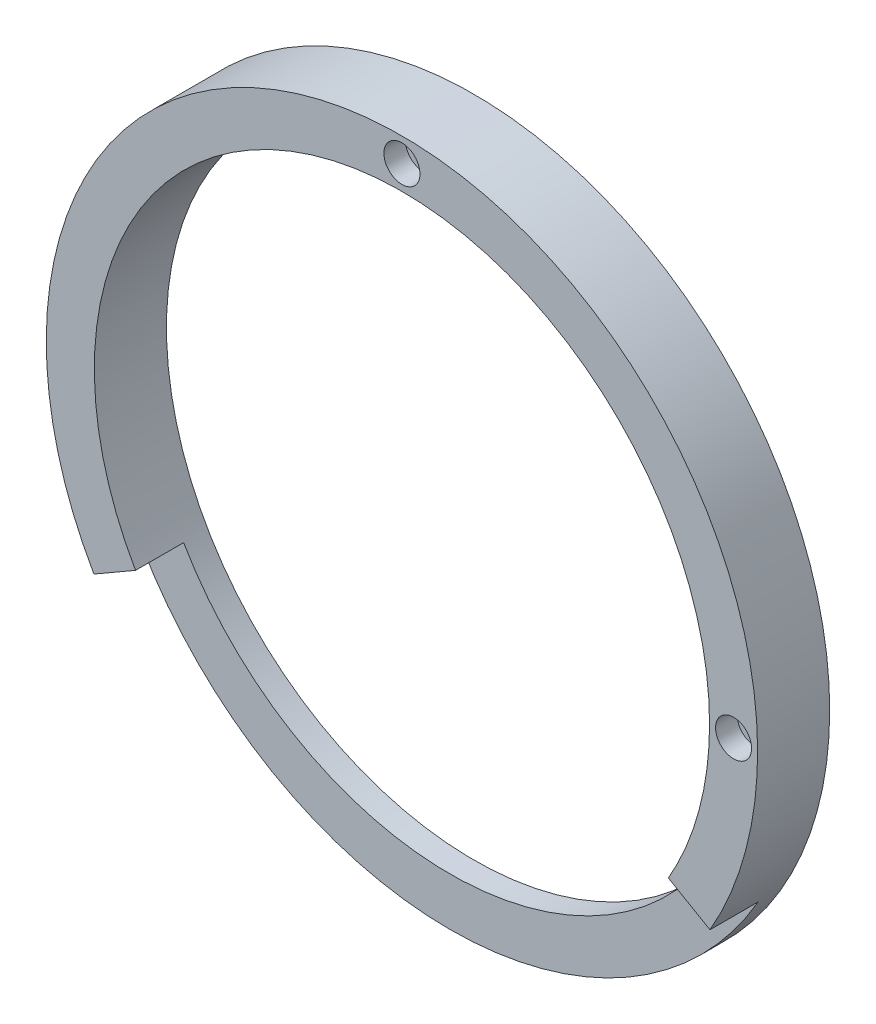
ISO-10303-21;
HEADER;
FILE_DESCRIPTION(('STEP AP214'),'2;1');
FILE_NAME('part.step','',(''),(''),'','','');
FILE_SCHEMA(('AUTOMOTIVE_DESIGN { 1 0 10303 214 1 1 1 1 }'));
ENDSEC;
DATA;
#1=APPLICATION_CONTEXT('core data for automotive mechanical design processes');
#2=APPLICATION_PROTOCOL_DEFINITION('international standard','automotive_design',2000,#1);
#3=PRODUCT_CONTEXT('',#1,'mechanical');
#4=PRODUCT('Part','Part','',(#3));
#5=PRODUCT_RELATED_PRODUCT_CATEGORY('part','',(#4));
#6=PRODUCT_DEFINITION_FORMATION('','',#4);
#7=PRODUCT_DEFINITION_CONTEXT('part definition',#1,'design');
#8=PRODUCT_DEFINITION('design','',#6,#7);
#9=PRODUCT_DEFINITION_SHAPE('','',#8);
#10=(LENGTH_UNIT() NAMED_UNIT(*) SI_UNIT(.MILLI.,.METRE.));
#11=(NAMED_UNIT(*) PLANE_ANGLE_UNIT() SI_UNIT($,.RADIAN.));
#12=(NAMED_UNIT(*) SI_UNIT($,.STERADIAN.) SOLID_ANGLE_UNIT());
#13=UNCERTAINTY_MEASURE_WITH_UNIT(LENGTH_MEASURE(1.E-05),#10,'distance_accuracy_value','');
#14=(GEOMETRIC_REPRESENTATION_CONTEXT(3) GLOBAL_UNCERTAINTY_ASSIGNED_CONTEXT((#13)) GLOBAL_UNIT_ASSIGNED_CONTEXT((#10,
#11,#12)) REPRESENTATION_CONTEXT('',''));
#15=CARTESIAN_POINT('',(0.,0.,0.));
#16=DIRECTION('',(0.,0.,1.));
#17=DIRECTION('',(1.,0.,0.));
#18=AXIS2_PLACEMENT_3D('',#15,#16,#17);
#19=CARTESIAN_POINT('',(-2.22044604925031E-13,69.,0.));
#20=DIRECTION('',(0.,0.,1.));
#21=DIRECTION('',(0.,1.,0.));
#22=AXIS2_PLACEMENT_3D('',#19,#20,#21);
#23=CYLINDRICAL_SURFACE('',#22,2.25);
#24=CARTESIAN_POINT('',(-2.22044604925031E-13,69.,0.));
#25=DIRECTION('',(0.,0.,1.));
#26=DIRECTION('',(0.,1.,0.));
#27=AXIS2_PLACEMENT_3D('',#24,#25,#26);
#28=CIRCLE('',#27,2.25);
#29=CARTESIAN_POINT('',(-2.29900442487527E-13,71.25,0.));
#30=VERTEX_POINT('',#29);
#31=EDGE_CURVE('E109',#30,#30,#28,.T.);
#32=ORIENTED_EDGE('',*,*,#31,.F.);
#33=EDGE_LOOP('',(#32));
#34=FACE_BOUND('',#33,.T.);
#35=CARTESIAN_POINT('',(-2.22044604925031E-13,69.,10.5));
#36=DIRECTION('',(0.,0.,1.));
#37=DIRECTION('',(1.,0.,0.));
#38=AXIS2_PLACEMENT_3D('',#35,#36,#37);
#39=CIRCLE('',#38,2.25);
#40=CARTESIAN_POINT('',(2.24999999999977,69.,10.5));
#41=VERTEX_POINT('',#40);
#42=EDGE_CURVE('E36',#41,#41,#39,.F.);
#43=ORIENTED_EDGE('',*,*,#42,.F.);
#44=EDGE_LOOP('',(#43));
#45=FACE_BOUND('',#44,.T.);
#46=ADVANCED_FACE('F32',(#34,#45),#23,.F.);
#47=CARTESIAN_POINT('',(69.,0.,0.));
#48=DIRECTION('',(0.,0.,1.));
#49=DIRECTION('',(1.,0.,0.));
#50=AXIS2_PLACEMENT_3D('',#47,#48,#49);
#51=CYLINDRICAL_SURFACE('',#50,2.25);
#52=CARTESIAN_POINT('',(69.,0.,0.));
#53=DIRECTION('',(0.,0.,1.));
#54=DIRECTION('',(1.,0.,0.));
#55=AXIS2_PLACEMENT_3D('',#52,#53,#54);
#56=CIRCLE('',#55,2.25);
#57=CARTESIAN_POINT('',(71.25,0.,0.));
#58=VERTEX_POINT('',#57);
#59=EDGE_CURVE('E93',#58,#58,#56,.T.);
#60=ORIENTED_EDGE('',*,*,#59,.F.);
#61=EDGE_LOOP('',(#60));
#62=FACE_BOUND('',#61,.T.);
#63=CARTESIAN_POINT('',(69.,0.,10.5));
#64=DIRECTION('',(0.,0.,1.));
#65=DIRECTION('',(1.,0.,0.));
#66=AXIS2_PLACEMENT_3D('',#63,#64,#65);
#67=CIRCLE('',#66,2.25);
#68=CARTESIAN_POINT('',(71.25,0.,10.5));
#69=VERTEX_POINT('',#68);
#70=EDGE_CURVE('E107',#69,#69,#67,.F.);
#71=ORIENTED_EDGE('',*,*,#70,.F.);
#72=EDGE_LOOP('',(#71));
#73=FACE_BOUND('',#72,.T.);
#74=ADVANCED_FACE('F151',(#62,#73),#51,.F.);
#75=CARTESIAN_POINT('',(0.,0.,15.));
#76=DIRECTION('',(0.,0.,-1.));
#77=DIRECTION('',(-1.,0.,0.));
#78=AXIS2_PLACEMENT_3D('',#75,#76,#77);
#79=CYLINDRICAL_SURFACE('',#78,74.);
#80=CARTESIAN_POINT('',(0.,0.,5.));
#81=DIRECTION('',(0.,0.,1.));
#82=DIRECTION('',(1.,0.,0.));
#83=AXIS2_PLACEMENT_3D('',#80,#81,#82);
#84=CIRCLE('',#83,74.);
#85=CARTESIAN_POINT('',(-64.0858798800487,-36.9999999999997,5.00000000000003));
#86=VERTEX_POINT('',#85);
#87=CARTESIAN_POINT('',(64.0858798800484,-37.0000000000001,5.00000000000003));
#88=VERTEX_POINT('',#87);
#89=EDGE_CURVE('E96',#86,#88,#84,.T.);
#90=ORIENTED_EDGE('',*,*,#89,.F.);
#91=DIRECTION('',(0.,0.,1.));
#92=VECTOR('',#91,1.);
#93=CARTESIAN_POINT('',(-64.0858798800487,-36.9999999999997,5.00000000000003));
#94=LINE('',#93,#92);
#95=CARTESIAN_POINT('',(-64.0858798800487,-36.9999999999996,15.));
#96=VERTEX_POINT('',#95);
#97=EDGE_CURVE('E57',#86,#96,#94,.T.);
#98=ORIENTED_EDGE('',*,*,#97,.T.);
#99=CARTESIAN_POINT('',(0.,0.,15.));
#100=DIRECTION('',(0.,0.,1.));
#101=DIRECTION('',(1.,0.,0.));
#102=AXIS2_PLACEMENT_3D('',#99,#100,#101);
#103=CIRCLE('',#102,74.);
#104=CARTESIAN_POINT('',(64.0858798800484,-37.0000000000001,15.));
#105=VERTEX_POINT('',#104);
#106=EDGE_CURVE('E11',#105,#96,#103,.T.);
#107=ORIENTED_EDGE('',*,*,#106,.F.);
#108=DIRECTION('',(0.,0.,1.));
#109=VECTOR('',#108,1.);
#110=CARTESIAN_POINT('',(64.0858798800484,-37.0000000000001,5.00000000000003));
#111=LINE('',#110,#109);
#112=EDGE_CURVE('E75',#88,#105,#111,.T.);
#113=ORIENTED_EDGE('',*,*,#112,.F.);
#114=EDGE_LOOP('',(#90,#98,#107,#113));
#115=FACE_BOUND('',#114,.T.);
#116=CARTESIAN_POINT('',(0.,0.,0.));
#117=DIRECTION('',(0.,0.,1.));
#118=DIRECTION('',(1.,0.,0.));
#119=AXIS2_PLACEMENT_3D('',#116,#117,#118);
#120=CIRCLE('',#119,74.);
#121=CARTESIAN_POINT('',(74.,0.,0.));
#122=VERTEX_POINT('',#121);
#123=EDGE_CURVE('E41',#122,#122,#120,.T.);
#124=ORIENTED_EDGE('',*,*,#123,.T.);
#125=EDGE_LOOP('',(#124));
#126=FACE_BOUND('',#125,.T.);
#127=ADVANCED_FACE('F34',(#115,#126),#79,.T.);
#128=CARTESIAN_POINT('',(0.,0.,15.));
#129=DIRECTION('',(0.,0.,1.));
#130=DIRECTION('',(1.,0.,0.));
#131=AXIS2_PLACEMENT_3D('',#128,#129,#130);
#132=PLANE('',#131);
#133=CARTESIAN_POINT('',(-1.11022302462516E-13,69.,15.));
#134=DIRECTION('',(0.,0.,1.));
#135=DIRECTION('',(0.,1.,0.));
#136=AXIS2_PLACEMENT_3D('',#133,#134,#135);
#137=CIRCLE('',#136,3.75000000000001);
#138=CARTESIAN_POINT('',(-1.24115365066676E-13,72.75,15.));
#139=VERTEX_POINT('',#138);
#140=EDGE_CURVE('E183',#139,#139,#137,.T.);
#141=ORIENTED_EDGE('',*,*,#140,.F.);
#142=EDGE_LOOP('',(#141));
#143=FACE_BOUND('',#142,.T.);
#144=CARTESIAN_POINT('',(69.,0.,15.));
#145=DIRECTION('',(0.,0.,1.));
#146=DIRECTION('',(1.,0.,0.));
#147=AXIS2_PLACEMENT_3D('',#144,#145,#146);
#148=CIRCLE('',#147,3.75000000000001);
#149=CARTESIAN_POINT('',(72.75,0.,15.));
#150=VERTEX_POINT('',#149);
#151=EDGE_CURVE('E116',#150,#150,#148,.T.);
#152=ORIENTED_EDGE('',*,*,#151,.F.);
#153=EDGE_LOOP('',(#152));
#154=FACE_BOUND('',#153,.T.);
#155=DIRECTION('',(-0.866025403784441,-0.499999999999995,0.));
#156=VECTOR('',#155,1.);
#157=CARTESIAN_POINT('',(-55.4256258422042,-31.9999999999997,15.));
#158=LINE('',#157,#156);
#159=CARTESIAN_POINT('',(-55.4256258422042,-31.9999999999997,15.));
#160=VERTEX_POINT('',#159);
#161=EDGE_CURVE('E92',#160,#96,#158,.T.);
#162=ORIENTED_EDGE('',*,*,#161,.F.);
#163=CARTESIAN_POINT('',(0.,0.,15.));
#164=DIRECTION('',(0.,0.,1.));
#165=DIRECTION('',(1.,0.,0.));
#166=AXIS2_PLACEMENT_3D('',#163,#164,#165);
#167=CIRCLE('',#166,64.);
#168=CARTESIAN_POINT('',(55.4256258422041,-32.,15.));
#169=VERTEX_POINT('',#168);
#170=EDGE_CURVE('E91',#169,#160,#167,.T.);
#171=ORIENTED_EDGE('',*,*,#170,.F.);
#172=DIRECTION('',(0.866025403784438,-0.500000000000001,0.));
#173=VECTOR('',#172,1.);
#174=CARTESIAN_POINT('',(55.4256258422041,-32.,15.));
#175=LINE('',#174,#173);
#176=EDGE_CURVE('E78',#169,#105,#175,.T.);
#177=ORIENTED_EDGE('',*,*,#176,.T.);
#178=ORIENTED_EDGE('',*,*,#106,.T.);
#179=EDGE_LOOP('',(#162,#171,#177,#178));
#180=FACE_BOUND('',#179,.T.);
#181=ADVANCED_FACE('F89',(#143,#154,#180),#132,.T.);
#182=CARTESIAN_POINT('',(0.,0.,0.));
#183=DIRECTION('',(0.,0.,1.));
#184=DIRECTION('',(1.,0.,0.));
#185=AXIS2_PLACEMENT_3D('',#182,#183,#184);
#186=PLANE('',#185);
#187=ORIENTED_EDGE('',*,*,#31,.T.);
#188=EDGE_LOOP('',(#187));
#189=FACE_BOUND('',#188,.T.);
#190=ORIENTED_EDGE('',*,*,#59,.T.);
#191=EDGE_LOOP('',(#190));
#192=FACE_BOUND('',#191,.T.);
#193=CARTESIAN_POINT('',(0.,0.,0.));
#194=DIRECTION('',(0.,0.,1.));
#195=DIRECTION('',(1.,0.,0.));
#196=AXIS2_PLACEMENT_3D('',#193,#194,#195);
#197=CIRCLE('',#196,64.);
#198=CARTESIAN_POINT('',(64.,0.,0.));
#199=VERTEX_POINT('',#198);
#200=EDGE_CURVE('E99',#199,#199,#197,.T.);
#201=ORIENTED_EDGE('',*,*,#200,.T.);
#202=EDGE_LOOP('',(#201));
#203=FACE_BOUND('',#202,.T.);
#204=ORIENTED_EDGE('',*,*,#123,.F.);
#205=EDGE_LOOP('',(#204));
#206=FACE_BOUND('',#205,.T.);
#207=ADVANCED_FACE('F145',(#189,#192,#203,#206),#186,.F.);
#208=CARTESIAN_POINT('',(0.,0.,0.));
#209=DIRECTION('',(0.,0.,1.));
#210=DIRECTION('',(1.,0.,0.));
#211=AXIS2_PLACEMENT_3D('',#208,#209,#210);
#212=CYLINDRICAL_SURFACE('',#211,64.);
#213=ORIENTED_EDGE('',*,*,#200,.F.);
#214=EDGE_LOOP('',(#213));
#215=FACE_BOUND('',#214,.T.);
#216=ORIENTED_EDGE('',*,*,#170,.T.);
#217=DIRECTION('',(0.,0.,1.));
#218=VECTOR('',#217,1.);
#219=CARTESIAN_POINT('',(-55.4256258422042,-31.9999999999997,5.));
#220=LINE('',#219,#218);
#221=CARTESIAN_POINT('',(-55.4256258422042,-31.9999999999997,5.));
#222=VERTEX_POINT('',#221);
#223=EDGE_CURVE('E97',#222,#160,#220,.T.);
#224=ORIENTED_EDGE('',*,*,#223,.F.);
#225=CARTESIAN_POINT('',(0.,0.,5.));
#226=DIRECTION('',(0.,0.,1.));
#227=DIRECTION('',(1.,0.,0.));
#228=AXIS2_PLACEMENT_3D('',#225,#226,#227);
#229=CIRCLE('',#228,64.);
#230=CARTESIAN_POINT('',(55.4256258422041,-32.0000000000001,5.));
#231=VERTEX_POINT('',#230);
#232=EDGE_CURVE('E129',#222,#231,#229,.T.);
#233=ORIENTED_EDGE('',*,*,#232,.T.);
#234=DIRECTION('',(0.,0.,1.));
#235=VECTOR('',#234,1.);
#236=CARTESIAN_POINT('',(55.4256258422041,-32.0000000000001,5.));
#237=LINE('',#236,#235);
#238=EDGE_CURVE('E83',#231,#169,#237,.T.);
#239=ORIENTED_EDGE('',*,*,#238,.T.);
#240=EDGE_LOOP('',(#216,#224,#233,#239));
#241=FACE_BOUND('',#240,.T.);
#242=ADVANCED_FACE('F133',(#215,#241),#212,.F.);
#243=CARTESIAN_POINT('',(-55.4256258422042,-31.9999999999997,5.));
#244=DIRECTION('',(-0.499999999999995,0.866025403784441,0.));
#245=DIRECTION('',(-0.866025403784441,-0.499999999999995,0.));
#246=AXIS2_PLACEMENT_3D('',#243,#244,#245);
#247=PLANE('',#246);
#248=ORIENTED_EDGE('',*,*,#223,.T.);
#249=ORIENTED_EDGE('',*,*,#161,.T.);
#250=ORIENTED_EDGE('',*,*,#97,.F.);
#251=DIRECTION('',(-0.866025403784441,-0.499999999999995,0.));
#252=VECTOR('',#251,1.);
#253=CARTESIAN_POINT('',(-55.4256258422042,-31.9999999999997,5.));
#254=LINE('',#253,#252);
#255=EDGE_CURVE('E84',#222,#86,#254,.T.);
#256=ORIENTED_EDGE('',*,*,#255,.F.);
#257=EDGE_LOOP('',(#248,#249,#250,#256));
#258=FACE_BOUND('',#257,.T.);
#259=ADVANCED_FACE('F136',(#258),#247,.F.);
#260=CARTESIAN_POINT('',(55.4256258422041,-32.0000000000001,5.));
#261=DIRECTION('',(-0.500000000000001,-0.866025403784438,0.));
#262=DIRECTION('',(0.866025403784438,-0.500000000000001,0.));
#263=AXIS2_PLACEMENT_3D('',#260,#261,#262);
#264=PLANE('',#263);
#265=DIRECTION('',(0.866025403784438,-0.500000000000001,0.));
#266=VECTOR('',#265,1.);
#267=CARTESIAN_POINT('',(55.4256258422041,-32.0000000000001,5.));
#268=LINE('',#267,#266);
#269=EDGE_CURVE('E49',#231,#88,#268,.T.);
#270=ORIENTED_EDGE('',*,*,#269,.T.);
#271=ORIENTED_EDGE('',*,*,#112,.T.);
#272=ORIENTED_EDGE('',*,*,#176,.F.);
#273=ORIENTED_EDGE('',*,*,#238,.F.);
#274=EDGE_LOOP('',(#270,#271,#272,#273));
#275=FACE_BOUND('',#274,.T.);
#276=ADVANCED_FACE('F77',(#275),#264,.T.);
#277=CARTESIAN_POINT('',(0.,0.,5.));
#278=DIRECTION('',(0.,0.,1.));
#279=DIRECTION('',(1.,0.,0.));
#280=AXIS2_PLACEMENT_3D('',#277,#278,#279);
#281=PLANE('',#280);
#282=ORIENTED_EDGE('',*,*,#89,.T.);
#283=ORIENTED_EDGE('',*,*,#269,.F.);
#284=ORIENTED_EDGE('',*,*,#232,.F.);
#285=ORIENTED_EDGE('',*,*,#255,.T.);
#286=EDGE_LOOP('',(#282,#283,#284,#285));
#287=FACE_BOUND('',#286,.T.);
#288=ADVANCED_FACE('F135',(#287),#281,.T.);
#289=CARTESIAN_POINT('',(69.,0.,10.5));
#290=DIRECTION('',(0.,0.,1.));
#291=DIRECTION('',(1.,0.,0.));
#292=AXIS2_PLACEMENT_3D('',#289,#290,#291);
#293=PLANE('',#292);
#294=CARTESIAN_POINT('',(69.,0.,10.5));
#295=DIRECTION('',(0.,0.,1.));
#296=DIRECTION('',(1.,0.,0.));
#297=AXIS2_PLACEMENT_3D('',#294,#295,#296);
#298=CIRCLE('',#297,3.75000000000001);
#299=CARTESIAN_POINT('',(72.75,0.,10.5));
#300=VERTEX_POINT('',#299);
#301=EDGE_CURVE('E110',#300,#300,#298,.T.);
#302=ORIENTED_EDGE('',*,*,#301,.T.);
#303=EDGE_LOOP('',(#302));
#304=FACE_BOUND('',#303,.T.);
#305=ORIENTED_EDGE('',*,*,#70,.T.);
#306=EDGE_LOOP('',(#305));
#307=FACE_BOUND('',#306,.T.);
#308=ADVANCED_FACE('F144',(#304,#307),#293,.T.);
#309=CARTESIAN_POINT('',(69.,0.,10.5));
#310=DIRECTION('',(0.,0.,1.));
#311=DIRECTION('',(1.,0.,0.));
#312=AXIS2_PLACEMENT_3D('',#309,#310,#311);
#313=CYLINDRICAL_SURFACE('',#312,3.75000000000001);
#314=ORIENTED_EDGE('',*,*,#301,.F.);
#315=EDGE_LOOP('',(#314));
#316=FACE_BOUND('',#315,.T.);
#317=ORIENTED_EDGE('',*,*,#151,.T.);
#318=EDGE_LOOP('',(#317));
#319=FACE_BOUND('',#318,.T.);
#320=ADVANCED_FACE('F162',(#316,#319),#313,.F.);
#321=CARTESIAN_POINT('',(-2.22044604925031E-13,69.,10.5));
#322=DIRECTION('',(0.,0.,1.));
#323=DIRECTION('',(0.,1.,0.));
#324=AXIS2_PLACEMENT_3D('',#321,#322,#323);
#325=PLANE('',#324);
#326=CARTESIAN_POINT('',(-2.22044604925031E-13,69.,10.5));
#327=DIRECTION('',(0.,0.,1.));
#328=DIRECTION('',(0.,1.,0.));
#329=AXIS2_PLACEMENT_3D('',#326,#327,#328);
#330=CIRCLE('',#329,3.75000000000001);
#331=CARTESIAN_POINT('',(-2.35137667529192E-13,72.7500000000001,10.5));
#332=VERTEX_POINT('',#331);
#333=EDGE_CURVE('E180',#332,#332,#330,.T.);
#334=ORIENTED_EDGE('',*,*,#333,.T.);
#335=EDGE_LOOP('',(#334));
#336=FACE_BOUND('',#335,.T.);
#337=ORIENTED_EDGE('',*,*,#42,.T.);
#338=EDGE_LOOP('',(#337));
#339=FACE_BOUND('',#338,.T.);
#340=ADVANCED_FACE('F165',(#336,#339),#325,.T.);
#341=CARTESIAN_POINT('',(-2.22044604925031E-13,69.,10.5));
#342=DIRECTION('',(0.,0.,1.));
#343=DIRECTION('',(0.,1.,0.));
#344=AXIS2_PLACEMENT_3D('',#341,#342,#343);
#345=CYLINDRICAL_SURFACE('',#344,3.75000000000001);
#346=ORIENTED_EDGE('',*,*,#333,.F.);
#347=EDGE_LOOP('',(#346));
#348=FACE_BOUND('',#347,.T.);
#349=ORIENTED_EDGE('',*,*,#140,.T.);
#350=EDGE_LOOP('',(#349));
#351=FACE_BOUND('',#350,.T.);
#352=ADVANCED_FACE('F171',(#348,#351),#345,.F.);
#353=CLOSED_SHELL('',(#46,#74,#127,#181,#207,#242,#259,#276,#288,#308,#320,#340,#352));
#354=MANIFOLD_SOLID_BREP('B2',#353);
#355=ADVANCED_BREP_SHAPE_REPRESENTATION('',(#18,#354),#14);
#356=SHAPE_DEFINITION_REPRESENTATION(#9,#355);
ENDSEC;
END-ISO-10303-21;
